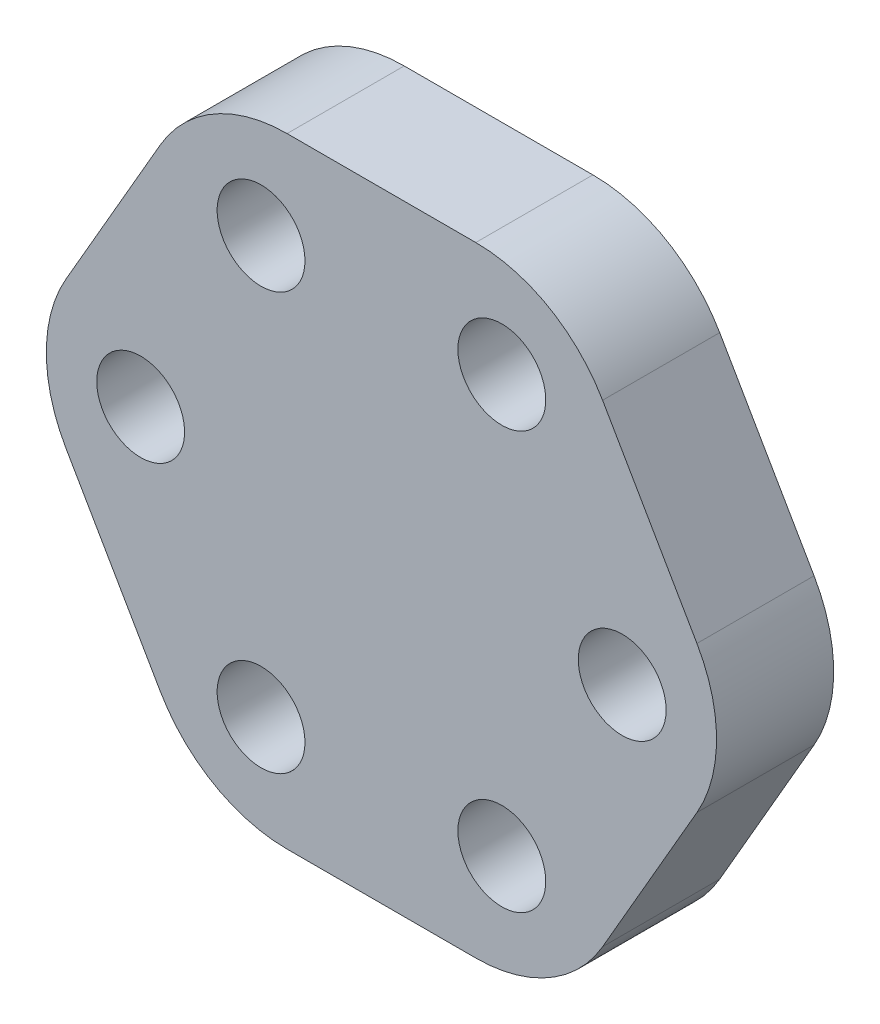
ISO-10303-21;
HEADER;
FILE_DESCRIPTION(('STEP AP214'),'2;1');
FILE_NAME('part.step','',(''),(''),'','','');
FILE_SCHEMA(('AUTOMOTIVE_DESIGN { 1 0 10303 214 1 1 1 1 }'));
ENDSEC;
DATA;
#1=APPLICATION_CONTEXT('core data for automotive mechanical design processes');
#2=APPLICATION_PROTOCOL_DEFINITION('international standard','automotive_design',2000,#1);
#3=PRODUCT_CONTEXT('',#1,'mechanical');
#4=PRODUCT('Part','Part','',(#3));
#5=PRODUCT_RELATED_PRODUCT_CATEGORY('part','',(#4));
#6=PRODUCT_DEFINITION_FORMATION('','',#4);
#7=PRODUCT_DEFINITION_CONTEXT('part definition',#1,'design');
#8=PRODUCT_DEFINITION('design','',#6,#7);
#9=PRODUCT_DEFINITION_SHAPE('','',#8);
#10=(LENGTH_UNIT() NAMED_UNIT(*) SI_UNIT(.MILLI.,.METRE.));
#11=(NAMED_UNIT(*) PLANE_ANGLE_UNIT() SI_UNIT($,.RADIAN.));
#12=(NAMED_UNIT(*) SI_UNIT($,.STERADIAN.) SOLID_ANGLE_UNIT());
#13=UNCERTAINTY_MEASURE_WITH_UNIT(LENGTH_MEASURE(1.E-05),#10,'distance_accuracy_value','');
#14=(GEOMETRIC_REPRESENTATION_CONTEXT(3) GLOBAL_UNCERTAINTY_ASSIGNED_CONTEXT((#13)) GLOBAL_UNIT_ASSIGNED_CONTEXT((#10,
#11,#12)) REPRESENTATION_CONTEXT('',''));
#15=CARTESIAN_POINT('',(0.,0.,0.));
#16=DIRECTION('',(0.,0.,1.));
#17=DIRECTION('',(1.,0.,0.));
#18=AXIS2_PLACEMENT_3D('',#15,#16,#17);
#19=CARTESIAN_POINT('',(-6.10912340178525,-10.5813121216001,4.));
#20=DIRECTION('',(0.,1.,0.));
#21=DIRECTION('',(0.,0.,1.));
#22=AXIS2_PLACEMENT_3D('',#19,#20,#21);
#23=PLANE('',#22);
#24=DIRECTION('',(1.,0.,0.));
#25=VECTOR('',#24,1.);
#26=CARTESIAN_POINT('',(-6.10912340178525,-10.5813121216001,0.));
#27=LINE('',#26,#25);
#28=CARTESIAN_POINT('',(-3.22237205583712,-10.5813121216001,0.));
#29=VERTEX_POINT('',#28);
#30=CARTESIAN_POINT('',(3.22237205583711,-10.5813121216001,0.));
#31=VERTEX_POINT('',#30);
#32=EDGE_CURVE('E153',#29,#31,#27,.T.);
#33=ORIENTED_EDGE('',*,*,#32,.T.);
#34=DIRECTION('',(0.,0.,-1.));
#35=VECTOR('',#34,1.);
#36=CARTESIAN_POINT('',(3.22237205583711,-10.5813121216001,4.));
#37=LINE('',#36,#35);
#38=CARTESIAN_POINT('',(3.22237205583711,-10.5813121216001,4.));
#39=VERTEX_POINT('',#38);
#40=EDGE_CURVE('E130',#31,#39,#37,.F.);
#41=ORIENTED_EDGE('',*,*,#40,.T.);
#42=DIRECTION('',(1.,0.,0.));
#43=VECTOR('',#42,1.);
#44=CARTESIAN_POINT('',(-6.10912340178525,-10.5813121216001,4.));
#45=LINE('',#44,#43);
#46=CARTESIAN_POINT('',(-3.22237205583712,-10.5813121216001,4.));
#47=VERTEX_POINT('',#46);
#48=EDGE_CURVE('E169',#47,#39,#45,.T.);
#49=ORIENTED_EDGE('',*,*,#48,.F.);
#50=DIRECTION('',(0.,0.,-1.));
#51=VECTOR('',#50,1.);
#52=CARTESIAN_POINT('',(-3.22237205583712,-10.5813121216001,4.));
#53=LINE('',#52,#51);
#54=EDGE_CURVE('E135',#47,#29,#53,.T.);
#55=ORIENTED_EDGE('',*,*,#54,.T.);
#56=EDGE_LOOP('',(#33,#41,#49,#55));
#57=FACE_BOUND('',#56,.T.);
#58=ADVANCED_FACE('F34',(#57),#23,.F.);
#59=CARTESIAN_POINT('',(6.10912340178524,-10.5813121216001,4.));
#60=DIRECTION('',(-0.866025403784439,0.5,0.));
#61=DIRECTION('',(-0.5,-0.866025403784439,0.));
#62=AXIS2_PLACEMENT_3D('',#59,#60,#61);
#63=PLANE('',#62);
#64=DIRECTION('',(0.5,0.866025403784439,0.));
#65=VECTOR('',#64,1.);
#66=CARTESIAN_POINT('',(6.10912340178524,-10.5813121216001,4.));
#67=LINE('',#66,#65);
#68=CARTESIAN_POINT('',(7.55249907475931,-8.08131212160006,4.));
#69=VERTEX_POINT('',#68);
#70=CARTESIAN_POINT('',(10.7748711305964,-2.49999999999999,4.));
#71=VERTEX_POINT('',#70);
#72=EDGE_CURVE('E145',#69,#71,#67,.T.);
#73=ORIENTED_EDGE('',*,*,#72,.F.);
#74=DIRECTION('',(0.,0.,-1.));
#75=VECTOR('',#74,1.);
#76=CARTESIAN_POINT('',(7.55249907475931,-8.08131212160006,4.));
#77=LINE('',#76,#75);
#78=CARTESIAN_POINT('',(7.55249907475931,-8.08131212160006,0.));
#79=VERTEX_POINT('',#78);
#80=EDGE_CURVE('E129',#69,#79,#77,.T.);
#81=ORIENTED_EDGE('',*,*,#80,.T.);
#82=DIRECTION('',(0.5,0.866025403784439,0.));
#83=VECTOR('',#82,1.);
#84=CARTESIAN_POINT('',(6.10912340178524,-10.5813121216001,0.));
#85=LINE('',#84,#83);
#86=CARTESIAN_POINT('',(10.7748711305964,-2.49999999999999,0.));
#87=VERTEX_POINT('',#86);
#88=EDGE_CURVE('E142',#79,#87,#85,.T.);
#89=ORIENTED_EDGE('',*,*,#88,.T.);
#90=DIRECTION('',(0.,0.,-1.));
#91=VECTOR('',#90,1.);
#92=CARTESIAN_POINT('',(10.7748711305964,-2.49999999999999,4.));
#93=LINE('',#92,#91);
#94=EDGE_CURVE('E147',#87,#71,#93,.F.);
#95=ORIENTED_EDGE('',*,*,#94,.T.);
#96=EDGE_LOOP('',(#73,#81,#89,#95));
#97=FACE_BOUND('',#96,.T.);
#98=ADVANCED_FACE('F141',(#97),#63,.F.);
#99=CARTESIAN_POINT('',(12.2182468035705,0.,4.));
#100=DIRECTION('',(-0.866025403784439,-0.5,0.));
#101=DIRECTION('',(0.5,-0.866025403784439,0.));
#102=AXIS2_PLACEMENT_3D('',#99,#100,#101);
#103=PLANE('',#102);
#104=DIRECTION('',(-0.5,0.866025403784438,0.));
#105=VECTOR('',#104,1.);
#106=CARTESIAN_POINT('',(12.2182468035705,0.,4.));
#107=LINE('',#106,#105);
#108=CARTESIAN_POINT('',(10.7748711305964,2.50000000000001,4.));
#109=VERTEX_POINT('',#108);
#110=CARTESIAN_POINT('',(7.55249907475931,8.08131212160006,4.));
#111=VERTEX_POINT('',#110);
#112=EDGE_CURVE('E222',#109,#111,#107,.T.);
#113=ORIENTED_EDGE('',*,*,#112,.F.);
#114=DIRECTION('',(0.,0.,-1.));
#115=VECTOR('',#114,1.);
#116=CARTESIAN_POINT('',(10.7748711305964,2.50000000000001,4.));
#117=LINE('',#116,#115);
#118=CARTESIAN_POINT('',(10.7748711305964,2.50000000000001,0.));
#119=VERTEX_POINT('',#118);
#120=EDGE_CURVE('E204',#109,#119,#117,.T.);
#121=ORIENTED_EDGE('',*,*,#120,.T.);
#122=DIRECTION('',(-0.5,0.866025403784438,0.));
#123=VECTOR('',#122,1.);
#124=CARTESIAN_POINT('',(12.2182468035705,0.,0.));
#125=LINE('',#124,#123);
#126=CARTESIAN_POINT('',(7.55249907475931,8.08131212160006,0.));
#127=VERTEX_POINT('',#126);
#128=EDGE_CURVE('E152',#119,#127,#125,.T.);
#129=ORIENTED_EDGE('',*,*,#128,.T.);
#130=DIRECTION('',(0.,0.,-1.));
#131=VECTOR('',#130,1.);
#132=CARTESIAN_POINT('',(7.55249907475931,8.08131212160007,4.));
#133=LINE('',#132,#131);
#134=EDGE_CURVE('E202',#127,#111,#133,.F.);
#135=ORIENTED_EDGE('',*,*,#134,.T.);
#136=EDGE_LOOP('',(#113,#121,#129,#135));
#137=FACE_BOUND('',#136,.T.);
#138=ADVANCED_FACE('F318',(#137),#103,.F.);
#139=CARTESIAN_POINT('',(6.10912340178525,10.5813121216001,4.));
#140=DIRECTION('',(0.,-1.,0.));
#141=DIRECTION('',(0.,0.,-1.));
#142=AXIS2_PLACEMENT_3D('',#139,#140,#141);
#143=PLANE('',#142);
#144=DIRECTION('',(-1.,0.,0.));
#145=VECTOR('',#144,1.);
#146=CARTESIAN_POINT('',(6.10912340178525,10.5813121216001,4.));
#147=LINE('',#146,#145);
#148=CARTESIAN_POINT('',(3.22237205583712,10.5813121216001,4.));
#149=VERTEX_POINT('',#148);
#150=CARTESIAN_POINT('',(-3.22237205583711,10.5813121216001,4.));
#151=VERTEX_POINT('',#150);
#152=EDGE_CURVE('E211',#149,#151,#147,.T.);
#153=ORIENTED_EDGE('',*,*,#152,.F.);
#154=DIRECTION('',(0.,0.,-1.));
#155=VECTOR('',#154,1.);
#156=CARTESIAN_POINT('',(3.22237205583712,10.5813121216001,4.));
#157=LINE('',#156,#155);
#158=CARTESIAN_POINT('',(3.22237205583712,10.5813121216001,0.));
#159=VERTEX_POINT('',#158);
#160=EDGE_CURVE('E11',#149,#159,#157,.T.);
#161=ORIENTED_EDGE('',*,*,#160,.T.);
#162=DIRECTION('',(-1.,0.,0.));
#163=VECTOR('',#162,1.);
#164=CARTESIAN_POINT('',(6.10912340178525,10.5813121216001,0.));
#165=LINE('',#164,#163);
#166=CARTESIAN_POINT('',(-3.22237205583711,10.5813121216001,0.));
#167=VERTEX_POINT('',#166);
#168=EDGE_CURVE('E156',#159,#167,#165,.T.);
#169=ORIENTED_EDGE('',*,*,#168,.T.);
#170=DIRECTION('',(0.,0.,-1.));
#171=VECTOR('',#170,1.);
#172=CARTESIAN_POINT('',(-3.22237205583711,10.5813121216001,4.));
#173=LINE('',#172,#171);
#174=EDGE_CURVE('E42',#167,#151,#173,.F.);
#175=ORIENTED_EDGE('',*,*,#174,.T.);
#176=EDGE_LOOP('',(#153,#161,#169,#175));
#177=FACE_BOUND('',#176,.T.);
#178=ADVANCED_FACE('F210',(#177),#143,.F.);
#179=CARTESIAN_POINT('',(-6.10912340178524,10.5813121216001,4.));
#180=DIRECTION('',(0.866025403784439,-0.5,0.));
#181=DIRECTION('',(0.5,0.866025403784439,0.));
#182=AXIS2_PLACEMENT_3D('',#179,#180,#181);
#183=PLANE('',#182);
#184=DIRECTION('',(-0.5,-0.866025403784439,0.));
#185=VECTOR('',#184,1.);
#186=CARTESIAN_POINT('',(-6.10912340178524,10.5813121216001,0.));
#187=LINE('',#186,#185);
#188=CARTESIAN_POINT('',(-7.55249907475931,8.08131212160006,0.));
#189=VERTEX_POINT('',#188);
#190=CARTESIAN_POINT('',(-10.7748711305964,2.5,0.));
#191=VERTEX_POINT('',#190);
#192=EDGE_CURVE('E164',#189,#191,#187,.T.);
#193=ORIENTED_EDGE('',*,*,#192,.T.);
#194=DIRECTION('',(0.,0.,-1.));
#195=VECTOR('',#194,1.);
#196=CARTESIAN_POINT('',(-10.7748711305964,2.5,4.));
#197=LINE('',#196,#195);
#198=CARTESIAN_POINT('',(-10.7748711305964,2.5,4.));
#199=VERTEX_POINT('',#198);
#200=EDGE_CURVE('E200',#191,#199,#197,.F.);
#201=ORIENTED_EDGE('',*,*,#200,.T.);
#202=DIRECTION('',(-0.5,-0.866025403784439,0.));
#203=VECTOR('',#202,1.);
#204=CARTESIAN_POINT('',(-6.10912340178524,10.5813121216001,4.));
#205=LINE('',#204,#203);
#206=CARTESIAN_POINT('',(-7.55249907475931,8.08131212160006,4.));
#207=VERTEX_POINT('',#206);
#208=EDGE_CURVE('E221',#207,#199,#205,.T.);
#209=ORIENTED_EDGE('',*,*,#208,.F.);
#210=DIRECTION('',(0.,0.,-1.));
#211=VECTOR('',#210,1.);
#212=CARTESIAN_POINT('',(-7.55249907475931,8.08131212160006,4.));
#213=LINE('',#212,#211);
#214=EDGE_CURVE('E197',#207,#189,#213,.T.);
#215=ORIENTED_EDGE('',*,*,#214,.T.);
#216=EDGE_LOOP('',(#193,#201,#209,#215));
#217=FACE_BOUND('',#216,.T.);
#218=ADVANCED_FACE('F227',(#217),#183,.F.);
#219=CARTESIAN_POINT('',(-12.2182468035705,0.,4.));
#220=DIRECTION('',(0.866025403784439,0.5,0.));
#221=DIRECTION('',(-0.5,0.866025403784439,0.));
#222=AXIS2_PLACEMENT_3D('',#219,#220,#221);
#223=PLANE('',#222);
#224=DIRECTION('',(0.5,-0.866025403784439,0.));
#225=VECTOR('',#224,1.);
#226=CARTESIAN_POINT('',(-12.2182468035705,0.,0.));
#227=LINE('',#226,#225);
#228=CARTESIAN_POINT('',(-10.7748711305964,-2.5,0.));
#229=VERTEX_POINT('',#228);
#230=CARTESIAN_POINT('',(-7.55249907475931,-8.08131212160006,0.));
#231=VERTEX_POINT('',#230);
#232=EDGE_CURVE('E167',#229,#231,#227,.T.);
#233=ORIENTED_EDGE('',*,*,#232,.T.);
#234=DIRECTION('',(0.,0.,-1.));
#235=VECTOR('',#234,1.);
#236=CARTESIAN_POINT('',(-7.55249907475931,-8.08131212160006,4.));
#237=LINE('',#236,#235);
#238=CARTESIAN_POINT('',(-7.55249907475931,-8.08131212160006,4.));
#239=VERTEX_POINT('',#238);
#240=EDGE_CURVE('E49',#231,#239,#237,.F.);
#241=ORIENTED_EDGE('',*,*,#240,.T.);
#242=DIRECTION('',(0.5,-0.866025403784439,0.));
#243=VECTOR('',#242,1.);
#244=CARTESIAN_POINT('',(-12.2182468035705,0.,4.));
#245=LINE('',#244,#243);
#246=CARTESIAN_POINT('',(-10.7748711305964,-2.5,4.));
#247=VERTEX_POINT('',#246);
#248=EDGE_CURVE('E170',#247,#239,#245,.T.);
#249=ORIENTED_EDGE('',*,*,#248,.F.);
#250=DIRECTION('',(0.,0.,-1.));
#251=VECTOR('',#250,1.);
#252=CARTESIAN_POINT('',(-10.7748711305964,-2.5,4.));
#253=LINE('',#252,#251);
#254=EDGE_CURVE('E193',#247,#229,#253,.T.);
#255=ORIENTED_EDGE('',*,*,#254,.T.);
#256=EDGE_LOOP('',(#233,#241,#249,#255));
#257=FACE_BOUND('',#256,.T.);
#258=ADVANCED_FACE('F233',(#257),#223,.F.);
#259=CARTESIAN_POINT('',(0.,0.,4.));
#260=DIRECTION('',(0.,0.,1.));
#261=DIRECTION('',(1.,0.,0.));
#262=AXIS2_PLACEMENT_3D('',#259,#260,#261);
#263=PLANE('',#262);
#264=CARTESIAN_POINT('',(8.22237205583712,0.,4.));
#265=DIRECTION('',(0.,0.,1.));
#266=DIRECTION('',(-0.500000000000004,0.866025403784436,0.));
#267=AXIS2_PLACEMENT_3D('',#264,#265,#266);
#268=CIRCLE('',#267,1.5);
#269=CARTESIAN_POINT('',(7.47237205583711,1.29903810567669,4.));
#270=VERTEX_POINT('',#269);
#271=EDGE_CURVE('E270',#270,#270,#268,.T.);
#272=ORIENTED_EDGE('',*,*,#271,.F.);
#273=EDGE_LOOP('',(#272));
#274=FACE_BOUND('',#273,.T.);
#275=CARTESIAN_POINT('',(4.11118602791856,7.12078307972222,4.));
#276=DIRECTION('',(0.,0.,1.));
#277=DIRECTION('',(-1.,0.,0.));
#278=AXIS2_PLACEMENT_3D('',#275,#276,#277);
#279=CIRCLE('',#278,1.5);
#280=CARTESIAN_POINT('',(2.61118602791856,7.12078307972222,4.));
#281=VERTEX_POINT('',#280);
#282=EDGE_CURVE('E264',#281,#281,#279,.T.);
#283=ORIENTED_EDGE('',*,*,#282,.F.);
#284=EDGE_LOOP('',(#283));
#285=FACE_BOUND('',#284,.T.);
#286=CARTESIAN_POINT('',(-4.11118602791862,7.12078307972219,4.));
#287=DIRECTION('',(0.,0.,1.));
#288=DIRECTION('',(-0.499999999999992,-0.866025403784443,0.));
#289=AXIS2_PLACEMENT_3D('',#286,#287,#288);
#290=CIRCLE('',#289,1.5);
#291=CARTESIAN_POINT('',(-4.86118602791861,5.82174497404552,4.));
#292=VERTEX_POINT('',#291);
#293=EDGE_CURVE('E258',#292,#292,#290,.T.);
#294=ORIENTED_EDGE('',*,*,#293,.F.);
#295=EDGE_LOOP('',(#294));
#296=FACE_BOUND('',#295,.T.);
#297=CARTESIAN_POINT('',(-8.22237205583712,0.,4.));
#298=DIRECTION('',(0.,0.,1.));
#299=DIRECTION('',(0.50000000000001,-0.866025403784433,0.));
#300=AXIS2_PLACEMENT_3D('',#297,#298,#299);
#301=CIRCLE('',#300,1.5);
#302=CARTESIAN_POINT('',(-7.4723720558371,-1.29903810567674,4.));
#303=VERTEX_POINT('',#302);
#304=EDGE_CURVE('E252',#303,#303,#301,.T.);
#305=ORIENTED_EDGE('',*,*,#304,.F.);
#306=EDGE_LOOP('',(#305));
#307=FACE_BOUND('',#306,.T.);
#308=CARTESIAN_POINT('',(4.11118602791857,-7.12078307972221,4.));
#309=DIRECTION('',(0.,0.,1.));
#310=DIRECTION('',(0.499999999999998,0.86602540378444,0.));
#311=AXIS2_PLACEMENT_3D('',#308,#309,#310);
#312=CIRCLE('',#311,1.5);
#313=CARTESIAN_POINT('',(4.86118602791857,-5.82174497404556,4.));
#314=VERTEX_POINT('',#313);
#315=EDGE_CURVE('E246',#314,#314,#312,.T.);
#316=ORIENTED_EDGE('',*,*,#315,.F.);
#317=EDGE_LOOP('',(#316));
#318=FACE_BOUND('',#317,.T.);
#319=CARTESIAN_POINT('',(-4.11118602791856,-7.12078307972222,4.));
#320=DIRECTION('',(0.,0.,1.));
#321=DIRECTION('',(1.,0.,0.));
#322=AXIS2_PLACEMENT_3D('',#319,#320,#321);
#323=CIRCLE('',#322,1.5);
#324=CARTESIAN_POINT('',(-2.61118602791856,-7.12078307972222,4.));
#325=VERTEX_POINT('',#324);
#326=EDGE_CURVE('E240',#325,#325,#323,.T.);
#327=ORIENTED_EDGE('',*,*,#326,.F.);
#328=EDGE_LOOP('',(#327));
#329=FACE_BOUND('',#328,.T.);
#330=ORIENTED_EDGE('',*,*,#48,.T.);
#331=CARTESIAN_POINT('',(3.22237205583711,-5.58131212160006,4.));
#332=DIRECTION('',(0.,0.,1.));
#333=DIRECTION('',(1.,0.,0.));
#334=AXIS2_PLACEMENT_3D('',#331,#332,#333);
#335=CIRCLE('',#334,5.);
#336=EDGE_CURVE('E191',#39,#69,#335,.T.);
#337=ORIENTED_EDGE('',*,*,#336,.T.);
#338=ORIENTED_EDGE('',*,*,#72,.T.);
#339=CARTESIAN_POINT('',(6.44474411167423,0.,4.));
#340=DIRECTION('',(0.,0.,1.));
#341=DIRECTION('',(1.,0.,0.));
#342=AXIS2_PLACEMENT_3D('',#339,#340,#341);
#343=CIRCLE('',#342,5.);
#344=EDGE_CURVE('E186',#71,#109,#343,.T.);
#345=ORIENTED_EDGE('',*,*,#344,.T.);
#346=ORIENTED_EDGE('',*,*,#112,.T.);
#347=CARTESIAN_POINT('',(3.22237205583712,5.58131212160006,4.));
#348=DIRECTION('',(0.,0.,1.));
#349=DIRECTION('',(1.,0.,0.));
#350=AXIS2_PLACEMENT_3D('',#347,#348,#349);
#351=CIRCLE('',#350,5.);
#352=EDGE_CURVE('E184',#111,#149,#351,.T.);
#353=ORIENTED_EDGE('',*,*,#352,.T.);
#354=ORIENTED_EDGE('',*,*,#152,.T.);
#355=CARTESIAN_POINT('',(-3.22237205583711,5.58131212160006,4.));
#356=DIRECTION('',(0.,0.,1.));
#357=DIRECTION('',(1.,0.,0.));
#358=AXIS2_PLACEMENT_3D('',#355,#356,#357);
#359=CIRCLE('',#358,5.);
#360=EDGE_CURVE('E182',#151,#207,#359,.T.);
#361=ORIENTED_EDGE('',*,*,#360,.T.);
#362=ORIENTED_EDGE('',*,*,#208,.T.);
#363=CARTESIAN_POINT('',(-6.44474411167423,0.,4.));
#364=DIRECTION('',(0.,0.,1.));
#365=DIRECTION('',(1.,0.,0.));
#366=AXIS2_PLACEMENT_3D('',#363,#364,#365);
#367=CIRCLE('',#366,5.);
#368=EDGE_CURVE('E56',#199,#247,#367,.T.);
#369=ORIENTED_EDGE('',*,*,#368,.T.);
#370=ORIENTED_EDGE('',*,*,#248,.T.);
#371=CARTESIAN_POINT('',(-3.22237205583712,-5.58131212160006,4.));
#372=DIRECTION('',(0.,0.,1.));
#373=DIRECTION('',(1.,0.,0.));
#374=AXIS2_PLACEMENT_3D('',#371,#372,#373);
#375=CIRCLE('',#374,5.);
#376=EDGE_CURVE('E189',#239,#47,#375,.T.);
#377=ORIENTED_EDGE('',*,*,#376,.T.);
#378=EDGE_LOOP('',(#330,#337,#338,#345,#346,#353,#354,#361,#362,#369,#370,#377));
#379=FACE_BOUND('',#378,.T.);
#380=ADVANCED_FACE('F217',(#274,#285,#296,#307,#318,#329,#379),#263,.T.);
#381=CARTESIAN_POINT('',(0.,0.,0.));
#382=DIRECTION('',(0.,0.,1.));
#383=DIRECTION('',(1.,0.,0.));
#384=AXIS2_PLACEMENT_3D('',#381,#382,#383);
#385=PLANE('',#384);
#386=CARTESIAN_POINT('',(8.22237205583712,0.,0.));
#387=DIRECTION('',(0.,0.,1.));
#388=DIRECTION('',(-0.500000000000004,0.866025403784436,0.));
#389=AXIS2_PLACEMENT_3D('',#386,#387,#388);
#390=CIRCLE('',#389,1.5);
#391=CARTESIAN_POINT('',(7.47237205583711,1.29903810567669,0.));
#392=VERTEX_POINT('',#391);
#393=EDGE_CURVE('E249',#392,#392,#390,.T.);
#394=ORIENTED_EDGE('',*,*,#393,.T.);
#395=EDGE_LOOP('',(#394));
#396=FACE_BOUND('',#395,.T.);
#397=CARTESIAN_POINT('',(4.11118602791856,7.12078307972222,0.));
#398=DIRECTION('',(0.,0.,1.));
#399=DIRECTION('',(-1.,0.,0.));
#400=AXIS2_PLACEMENT_3D('',#397,#398,#399);
#401=CIRCLE('',#400,1.5);
#402=CARTESIAN_POINT('',(2.61118602791856,7.12078307972222,0.));
#403=VERTEX_POINT('',#402);
#404=EDGE_CURVE('E267',#403,#403,#401,.T.);
#405=ORIENTED_EDGE('',*,*,#404,.T.);
#406=EDGE_LOOP('',(#405));
#407=FACE_BOUND('',#406,.T.);
#408=CARTESIAN_POINT('',(-4.11118602791862,7.12078307972219,0.));
#409=DIRECTION('',(0.,0.,1.));
#410=DIRECTION('',(-0.499999999999992,-0.866025403784443,0.));
#411=AXIS2_PLACEMENT_3D('',#408,#409,#410);
#412=CIRCLE('',#411,1.5);
#413=CARTESIAN_POINT('',(-4.86118602791861,5.82174497404552,0.));
#414=VERTEX_POINT('',#413);
#415=EDGE_CURVE('E261',#414,#414,#412,.T.);
#416=ORIENTED_EDGE('',*,*,#415,.T.);
#417=EDGE_LOOP('',(#416));
#418=FACE_BOUND('',#417,.T.);
#419=CARTESIAN_POINT('',(-8.22237205583712,0.,0.));
#420=DIRECTION('',(0.,0.,1.));
#421=DIRECTION('',(0.50000000000001,-0.866025403784433,0.));
#422=AXIS2_PLACEMENT_3D('',#419,#420,#421);
#423=CIRCLE('',#422,1.5);
#424=CARTESIAN_POINT('',(-7.4723720558371,-1.29903810567674,0.));
#425=VERTEX_POINT('',#424);
#426=EDGE_CURVE('E255',#425,#425,#423,.T.);
#427=ORIENTED_EDGE('',*,*,#426,.T.);
#428=EDGE_LOOP('',(#427));
#429=FACE_BOUND('',#428,.T.);
#430=CARTESIAN_POINT('',(4.11118602791857,-7.12078307972221,0.));
#431=DIRECTION('',(0.,0.,1.));
#432=DIRECTION('',(0.499999999999998,0.86602540378444,0.));
#433=AXIS2_PLACEMENT_3D('',#430,#431,#432);
#434=CIRCLE('',#433,1.5);
#435=CARTESIAN_POINT('',(4.86118602791857,-5.82174497404556,0.));
#436=VERTEX_POINT('',#435);
#437=EDGE_CURVE('E243',#436,#436,#434,.T.);
#438=ORIENTED_EDGE('',*,*,#437,.T.);
#439=EDGE_LOOP('',(#438));
#440=FACE_BOUND('',#439,.T.);
#441=CARTESIAN_POINT('',(-4.11118602791856,-7.12078307972222,0.));
#442=DIRECTION('',(0.,0.,1.));
#443=DIRECTION('',(1.,0.,0.));
#444=AXIS2_PLACEMENT_3D('',#441,#442,#443);
#445=CIRCLE('',#444,1.5);
#446=CARTESIAN_POINT('',(-2.61118602791856,-7.12078307972222,0.));
#447=VERTEX_POINT('',#446);
#448=EDGE_CURVE('E158',#447,#447,#445,.T.);
#449=ORIENTED_EDGE('',*,*,#448,.T.);
#450=EDGE_LOOP('',(#449));
#451=FACE_BOUND('',#450,.T.);
#452=ORIENTED_EDGE('',*,*,#88,.F.);
#453=CARTESIAN_POINT('',(3.22237205583711,-5.58131212160006,0.));
#454=DIRECTION('',(0.,0.,1.));
#455=DIRECTION('',(1.,0.,0.));
#456=AXIS2_PLACEMENT_3D('',#453,#454,#455);
#457=CIRCLE('',#456,5.);
#458=EDGE_CURVE('E125',#79,#31,#457,.F.);
#459=ORIENTED_EDGE('',*,*,#458,.T.);
#460=ORIENTED_EDGE('',*,*,#32,.F.);
#461=CARTESIAN_POINT('',(-3.22237205583712,-5.58131212160006,0.));
#462=DIRECTION('',(0.,0.,1.));
#463=DIRECTION('',(1.,0.,0.));
#464=AXIS2_PLACEMENT_3D('',#461,#462,#463);
#465=CIRCLE('',#464,5.);
#466=EDGE_CURVE('E136',#29,#231,#465,.F.);
#467=ORIENTED_EDGE('',*,*,#466,.T.);
#468=ORIENTED_EDGE('',*,*,#232,.F.);
#469=CARTESIAN_POINT('',(-6.44474411167423,0.,0.));
#470=DIRECTION('',(0.,0.,1.));
#471=DIRECTION('',(1.,0.,0.));
#472=AXIS2_PLACEMENT_3D('',#469,#470,#471);
#473=CIRCLE('',#472,5.);
#474=EDGE_CURVE('E176',#229,#191,#473,.F.);
#475=ORIENTED_EDGE('',*,*,#474,.T.);
#476=ORIENTED_EDGE('',*,*,#192,.F.);
#477=CARTESIAN_POINT('',(-3.22237205583711,5.58131212160006,0.));
#478=DIRECTION('',(0.,0.,1.));
#479=DIRECTION('',(1.,0.,0.));
#480=AXIS2_PLACEMENT_3D('',#477,#478,#479);
#481=CIRCLE('',#480,5.);
#482=EDGE_CURVE('E146',#189,#167,#481,.F.);
#483=ORIENTED_EDGE('',*,*,#482,.T.);
#484=ORIENTED_EDGE('',*,*,#168,.F.);
#485=CARTESIAN_POINT('',(3.22237205583712,5.58131212160006,0.));
#486=DIRECTION('',(0.,0.,1.));
#487=DIRECTION('',(1.,0.,0.));
#488=AXIS2_PLACEMENT_3D('',#485,#486,#487);
#489=CIRCLE('',#488,5.);
#490=EDGE_CURVE('E173',#159,#127,#489,.F.);
#491=ORIENTED_EDGE('',*,*,#490,.T.);
#492=ORIENTED_EDGE('',*,*,#128,.F.);
#493=CARTESIAN_POINT('',(6.44474411167423,0.,0.));
#494=DIRECTION('',(0.,0.,1.));
#495=DIRECTION('',(1.,0.,0.));
#496=AXIS2_PLACEMENT_3D('',#493,#494,#495);
#497=CIRCLE('',#496,5.);
#498=EDGE_CURVE('E151',#119,#87,#497,.F.);
#499=ORIENTED_EDGE('',*,*,#498,.T.);
#500=EDGE_LOOP('',(#452,#459,#460,#467,#468,#475,#476,#483,#484,#491,#492,#499));
#501=FACE_BOUND('',#500,.T.);
#502=ADVANCED_FACE('F149',(#396,#407,#418,#429,#440,#451,#501),#385,.F.);
#503=CARTESIAN_POINT('',(3.22237205583711,-5.58131212160006,4.));
#504=DIRECTION('',(0.,0.,-1.));
#505=DIRECTION('',(-1.,0.,0.));
#506=AXIS2_PLACEMENT_3D('',#503,#504,#505);
#507=CYLINDRICAL_SURFACE('',#506,5.);
#508=ORIENTED_EDGE('',*,*,#336,.F.);
#509=ORIENTED_EDGE('',*,*,#40,.F.);
#510=ORIENTED_EDGE('',*,*,#458,.F.);
#511=ORIENTED_EDGE('',*,*,#80,.F.);
#512=EDGE_LOOP('',(#508,#509,#510,#511));
#513=FACE_BOUND('',#512,.T.);
#514=ADVANCED_FACE('F128',(#513),#507,.T.);
#515=CARTESIAN_POINT('',(-3.22237205583712,-5.58131212160006,4.));
#516=DIRECTION('',(0.,0.,-1.));
#517=DIRECTION('',(-1.,0.,0.));
#518=AXIS2_PLACEMENT_3D('',#515,#516,#517);
#519=CYLINDRICAL_SURFACE('',#518,5.);
#520=ORIENTED_EDGE('',*,*,#376,.F.);
#521=ORIENTED_EDGE('',*,*,#240,.F.);
#522=ORIENTED_EDGE('',*,*,#466,.F.);
#523=ORIENTED_EDGE('',*,*,#54,.F.);
#524=EDGE_LOOP('',(#520,#521,#522,#523));
#525=FACE_BOUND('',#524,.T.);
#526=ADVANCED_FACE('F324',(#525),#519,.T.);
#527=CARTESIAN_POINT('',(-6.44474411167423,0.,4.));
#528=DIRECTION('',(0.,0.,-1.));
#529=DIRECTION('',(-1.,0.,0.));
#530=AXIS2_PLACEMENT_3D('',#527,#528,#529);
#531=CYLINDRICAL_SURFACE('',#530,5.);
#532=ORIENTED_EDGE('',*,*,#368,.F.);
#533=ORIENTED_EDGE('',*,*,#200,.F.);
#534=ORIENTED_EDGE('',*,*,#474,.F.);
#535=ORIENTED_EDGE('',*,*,#254,.F.);
#536=EDGE_LOOP('',(#532,#533,#534,#535));
#537=FACE_BOUND('',#536,.T.);
#538=ADVANCED_FACE('F232',(#537),#531,.T.);
#539=CARTESIAN_POINT('',(6.44474411167423,0.,4.));
#540=DIRECTION('',(0.,0.,-1.));
#541=DIRECTION('',(-1.,0.,0.));
#542=AXIS2_PLACEMENT_3D('',#539,#540,#541);
#543=CYLINDRICAL_SURFACE('',#542,5.);
#544=ORIENTED_EDGE('',*,*,#344,.F.);
#545=ORIENTED_EDGE('',*,*,#94,.F.);
#546=ORIENTED_EDGE('',*,*,#498,.F.);
#547=ORIENTED_EDGE('',*,*,#120,.F.);
#548=EDGE_LOOP('',(#544,#545,#546,#547));
#549=FACE_BOUND('',#548,.T.);
#550=ADVANCED_FACE('F330',(#549),#543,.T.);
#551=CARTESIAN_POINT('',(3.22237205583712,5.58131212160006,4.));
#552=DIRECTION('',(0.,0.,-1.));
#553=DIRECTION('',(-1.,0.,0.));
#554=AXIS2_PLACEMENT_3D('',#551,#552,#553);
#555=CYLINDRICAL_SURFACE('',#554,5.);
#556=ORIENTED_EDGE('',*,*,#352,.F.);
#557=ORIENTED_EDGE('',*,*,#134,.F.);
#558=ORIENTED_EDGE('',*,*,#490,.F.);
#559=ORIENTED_EDGE('',*,*,#160,.F.);
#560=EDGE_LOOP('',(#556,#557,#558,#559));
#561=FACE_BOUND('',#560,.T.);
#562=ADVANCED_FACE('F310',(#561),#555,.T.);
#563=CARTESIAN_POINT('',(-3.22237205583711,5.58131212160006,4.));
#564=DIRECTION('',(0.,0.,-1.));
#565=DIRECTION('',(-1.,0.,0.));
#566=AXIS2_PLACEMENT_3D('',#563,#564,#565);
#567=CYLINDRICAL_SURFACE('',#566,5.);
#568=ORIENTED_EDGE('',*,*,#360,.F.);
#569=ORIENTED_EDGE('',*,*,#174,.F.);
#570=ORIENTED_EDGE('',*,*,#482,.F.);
#571=ORIENTED_EDGE('',*,*,#214,.F.);
#572=EDGE_LOOP('',(#568,#569,#570,#571));
#573=FACE_BOUND('',#572,.T.);
#574=ADVANCED_FACE('F36',(#573),#567,.T.);
#575=CARTESIAN_POINT('',(-4.11118602791856,-7.12078307972222,0.));
#576=DIRECTION('',(0.,0.,1.));
#577=DIRECTION('',(1.,0.,0.));
#578=AXIS2_PLACEMENT_3D('',#575,#576,#577);
#579=CYLINDRICAL_SURFACE('',#578,1.5);
#580=ORIENTED_EDGE('',*,*,#448,.F.);
#581=EDGE_LOOP('',(#580));
#582=FACE_BOUND('',#581,.T.);
#583=ORIENTED_EDGE('',*,*,#326,.T.);
#584=EDGE_LOOP('',(#583));
#585=FACE_BOUND('',#584,.T.);
#586=ADVANCED_FACE('F298',(#582,#585),#579,.F.);
#587=CARTESIAN_POINT('',(4.11118602791857,-7.12078307972221,0.));
#588=DIRECTION('',(0.,0.,1.));
#589=DIRECTION('',(1.,0.,0.));
#590=AXIS2_PLACEMENT_3D('',#587,#588,#589);
#591=CYLINDRICAL_SURFACE('',#590,1.5);
#592=ORIENTED_EDGE('',*,*,#437,.F.);
#593=EDGE_LOOP('',(#592));
#594=FACE_BOUND('',#593,.T.);
#595=ORIENTED_EDGE('',*,*,#315,.T.);
#596=EDGE_LOOP('',(#595));
#597=FACE_BOUND('',#596,.T.);
#598=ADVANCED_FACE('F300',(#594,#597),#591,.F.);
#599=CARTESIAN_POINT('',(-8.22237205583712,0.,0.));
#600=DIRECTION('',(0.,0.,1.));
#601=DIRECTION('',(1.,0.,0.));
#602=AXIS2_PLACEMENT_3D('',#599,#600,#601);
#603=CYLINDRICAL_SURFACE('',#602,1.5);
#604=ORIENTED_EDGE('',*,*,#426,.F.);
#605=EDGE_LOOP('',(#604));
#606=FACE_BOUND('',#605,.T.);
#607=ORIENTED_EDGE('',*,*,#304,.T.);
#608=EDGE_LOOP('',(#607));
#609=FACE_BOUND('',#608,.T.);
#610=ADVANCED_FACE('F307',(#606,#609),#603,.F.);
#611=CARTESIAN_POINT('',(-4.11118602791862,7.12078307972219,0.));
#612=DIRECTION('',(0.,0.,1.));
#613=DIRECTION('',(1.,0.,0.));
#614=AXIS2_PLACEMENT_3D('',#611,#612,#613);
#615=CYLINDRICAL_SURFACE('',#614,1.5);
#616=ORIENTED_EDGE('',*,*,#415,.F.);
#617=EDGE_LOOP('',(#616));
#618=FACE_BOUND('',#617,.T.);
#619=ORIENTED_EDGE('',*,*,#293,.T.);
#620=EDGE_LOOP('',(#619));
#621=FACE_BOUND('',#620,.T.);
#622=ADVANCED_FACE('F448',(#618,#621),#615,.F.);
#623=CARTESIAN_POINT('',(4.11118602791856,7.12078307972222,0.));
#624=DIRECTION('',(0.,0.,1.));
#625=DIRECTION('',(1.,0.,0.));
#626=AXIS2_PLACEMENT_3D('',#623,#624,#625);
#627=CYLINDRICAL_SURFACE('',#626,1.5);
#628=ORIENTED_EDGE('',*,*,#404,.F.);
#629=EDGE_LOOP('',(#628));
#630=FACE_BOUND('',#629,.T.);
#631=ORIENTED_EDGE('',*,*,#282,.T.);
#632=EDGE_LOOP('',(#631));
#633=FACE_BOUND('',#632,.T.);
#634=ADVANCED_FACE('F281',(#630,#633),#627,.F.);
#635=CARTESIAN_POINT('',(8.22237205583712,0.,0.));
#636=DIRECTION('',(0.,0.,1.));
#637=DIRECTION('',(1.,0.,0.));
#638=AXIS2_PLACEMENT_3D('',#635,#636,#637);
#639=CYLINDRICAL_SURFACE('',#638,1.5);
#640=ORIENTED_EDGE('',*,*,#393,.F.);
#641=EDGE_LOOP('',(#640));
#642=FACE_BOUND('',#641,.T.);
#643=ORIENTED_EDGE('',*,*,#271,.T.);
#644=EDGE_LOOP('',(#643));
#645=FACE_BOUND('',#644,.T.);
#646=ADVANCED_FACE('F278',(#642,#645),#639,.F.);
#647=CLOSED_SHELL('',(#58,#98,#138,#178,#218,#258,#380,#502,#514,#526,#538,#550,#562,#574,#586,
#598,#610,#622,#634,#646));
#648=MANIFOLD_SOLID_BREP('B2',#647);
#649=ADVANCED_BREP_SHAPE_REPRESENTATION('',(#18,#648),#14);
#650=SHAPE_DEFINITION_REPRESENTATION(#9,#649);
ENDSEC;
END-ISO-10303-21;
